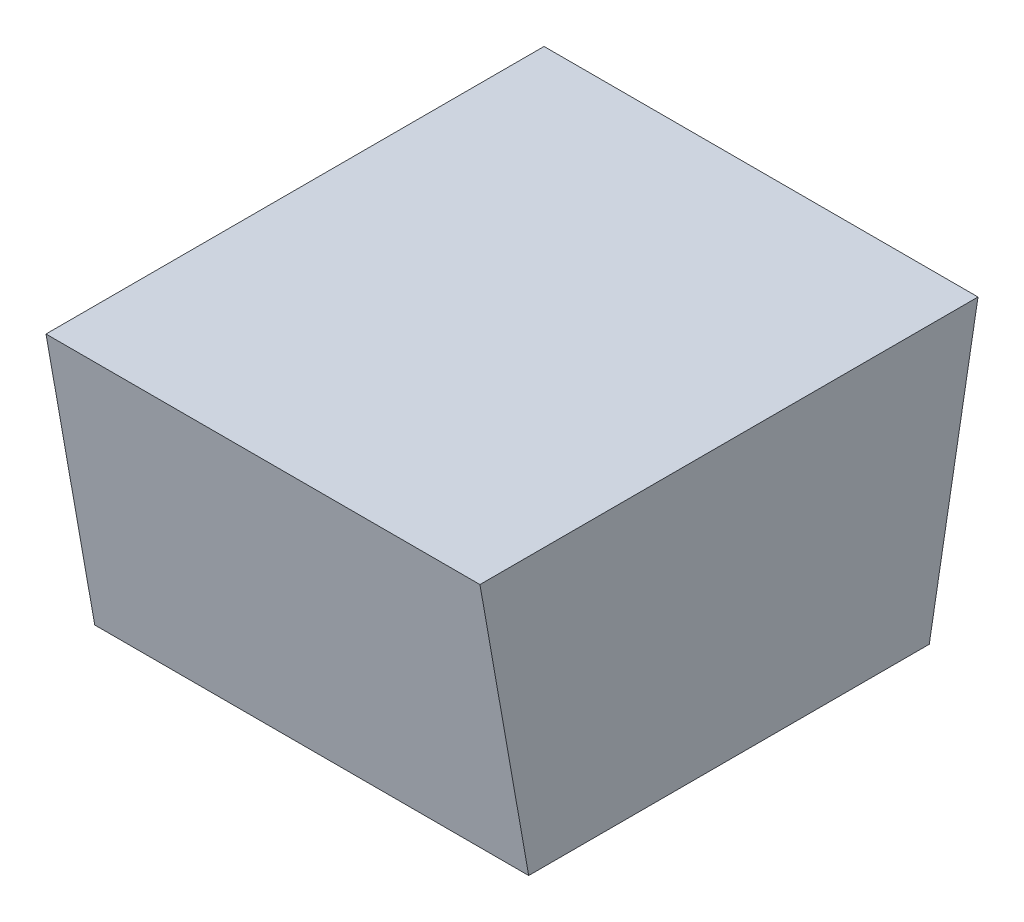
ISO-10303-21;
HEADER;
FILE_DESCRIPTION(('STEP AP214'),'2;1');
FILE_NAME('part.step','',(''),(''),'','','');
FILE_SCHEMA(('AUTOMOTIVE_DESIGN { 1 0 10303 214 1 1 1 1 }'));
ENDSEC;
DATA;
#1=APPLICATION_CONTEXT('core data for automotive mechanical design processes');
#2=APPLICATION_PROTOCOL_DEFINITION('international standard','automotive_design',2000,#1);
#3=PRODUCT_CONTEXT('',#1,'mechanical');
#4=PRODUCT('Part','Part','',(#3));
#5=PRODUCT_RELATED_PRODUCT_CATEGORY('part','',(#4));
#6=PRODUCT_DEFINITION_FORMATION('','',#4);
#7=PRODUCT_DEFINITION_CONTEXT('part definition',#1,'design');
#8=PRODUCT_DEFINITION('design','',#6,#7);
#9=PRODUCT_DEFINITION_SHAPE('','',#8);
#10=(LENGTH_UNIT() NAMED_UNIT(*) SI_UNIT(.MILLI.,.METRE.));
#11=(NAMED_UNIT(*) PLANE_ANGLE_UNIT() SI_UNIT($,.RADIAN.));
#12=(NAMED_UNIT(*) SI_UNIT($,.STERADIAN.) SOLID_ANGLE_UNIT());
#13=UNCERTAINTY_MEASURE_WITH_UNIT(LENGTH_MEASURE(1.E-05),#10,'distance_accuracy_value','');
#14=(GEOMETRIC_REPRESENTATION_CONTEXT(3) GLOBAL_UNCERTAINTY_ASSIGNED_CONTEXT((#13)) GLOBAL_UNIT_ASSIGNED_CONTEXT((#10,
#11,#12)) REPRESENTATION_CONTEXT('',''));
#15=CARTESIAN_POINT('',(0.,0.,0.));
#16=DIRECTION('',(0.,0.,1.));
#17=DIRECTION('',(1.,0.,0.));
#18=AXIS2_PLACEMENT_3D('',#15,#16,#17);
#19=CARTESIAN_POINT('',(0.,0.414017929910338,0.));
#20=DIRECTION('',(0.,1.,0.));
#21=DIRECTION('',(0.,0.,1.));
#22=AXIS2_PLACEMENT_3D('',#19,#20,#21);
#23=PLANE('',#22);
#24=DIRECTION('',(0.,0.,-1.));
#25=VECTOR('',#24,1.);
#26=CARTESIAN_POINT('',(-0.324499859,0.414017929910338,1.508500031));
#27=LINE('',#26,#25);
#28=CARTESIAN_POINT('',(-0.324499859,0.414017929910338,0.373002566540259));
#29=VERTEX_POINT('',#28);
#30=CARTESIAN_POINT('',(-0.324499859,0.414017929910338,-0.373002566540259));
#31=VERTEX_POINT('',#30);
#32=EDGE_CURVE('E92',#29,#31,#27,.T.);
#33=ORIENTED_EDGE('',*,*,#32,.F.);
#34=DIRECTION('',(-1.,0.,0.));
#35=VECTOR('',#34,1.);
#36=CARTESIAN_POINT('',(1.508500031,0.414017929910338,0.373002566540259));
#37=LINE('',#36,#35);
#38=CARTESIAN_POINT('',(0.325500111,0.414017929910338,0.373002566540259));
#39=VERTEX_POINT('',#38);
#40=EDGE_CURVE('E57',#39,#29,#37,.T.);
#41=ORIENTED_EDGE('',*,*,#40,.F.);
#42=DIRECTION('',(0.,0.,1.));
#43=VECTOR('',#42,1.);
#44=CARTESIAN_POINT('',(0.325500111,0.414017929910338,1.508500031));
#45=LINE('',#44,#43);
#46=CARTESIAN_POINT('',(0.325500111,0.414017929910338,-0.373002566540259));
#47=VERTEX_POINT('',#46);
#48=EDGE_CURVE('E12',#47,#39,#45,.T.);
#49=ORIENTED_EDGE('',*,*,#48,.F.);
#50=DIRECTION('',(1.,0.,0.));
#51=VECTOR('',#50,1.);
#52=CARTESIAN_POINT('',(1.508500031,0.414017929910338,-0.373002566540259));
#53=LINE('',#52,#51);
#54=EDGE_CURVE('E81',#31,#47,#53,.T.);
#55=ORIENTED_EDGE('',*,*,#54,.F.);
#56=EDGE_LOOP('',(#33,#41,#49,#55));
#57=FACE_BOUND('',#56,.T.);
#58=ADVANCED_FACE('F42',(#57),#23,.T.);
#59=CARTESIAN_POINT('',(1.508500031,0.,-0.300000035));
#60=DIRECTION('',(0.,-0.173648177666931,-0.984807753012208));
#61=DIRECTION('',(0.,0.984807753012208,-0.173648177666931));
#62=AXIS2_PLACEMENT_3D('',#59,#60,#61);
#63=PLANE('',#62);
#64=DIRECTION('',(0.,0.984807753012208,-0.173648177666931));
#65=VECTOR('',#64,1.);
#66=CARTESIAN_POINT('',(-0.324499859,0.,-0.300000035));
#67=LINE('',#66,#65);
#68=CARTESIAN_POINT('',(-0.324499859,0.,-0.300000035));
#69=VERTEX_POINT('',#68);
#70=EDGE_CURVE('E91',#69,#31,#67,.T.);
#71=ORIENTED_EDGE('',*,*,#70,.T.);
#72=ORIENTED_EDGE('',*,*,#54,.T.);
#73=DIRECTION('',(0.,-0.984807753012208,0.173648177666931));
#74=VECTOR('',#73,1.);
#75=CARTESIAN_POINT('',(0.325500111,0.,-0.300000035));
#76=LINE('',#75,#74);
#77=CARTESIAN_POINT('',(0.325500111,0.,-0.300000035));
#78=VERTEX_POINT('',#77);
#79=EDGE_CURVE('E88',#47,#78,#76,.T.);
#80=ORIENTED_EDGE('',*,*,#79,.T.);
#81=DIRECTION('',(-1.,0.,0.));
#82=VECTOR('',#81,1.);
#83=CARTESIAN_POINT('',(1.508500031,0.,-0.300000035));
#84=LINE('',#83,#82);
#85=EDGE_CURVE('E107',#78,#69,#84,.T.);
#86=ORIENTED_EDGE('',*,*,#85,.T.);
#87=EDGE_LOOP('',(#71,#72,#80,#86));
#88=FACE_BOUND('',#87,.T.);
#89=ADVANCED_FACE('F87',(#88),#63,.T.);
#90=CARTESIAN_POINT('',(1.508500031,0.,0.300000035));
#91=DIRECTION('',(0.,-0.173648177666931,0.984807753012208));
#92=DIRECTION('',(0.,-0.984807753012208,-0.173648177666931));
#93=AXIS2_PLACEMENT_3D('',#90,#91,#92);
#94=PLANE('',#93);
#95=DIRECTION('',(0.,0.984807753012208,0.173648177666931));
#96=VECTOR('',#95,1.);
#97=CARTESIAN_POINT('',(0.325500111,0.,0.300000035));
#98=LINE('',#97,#96);
#99=CARTESIAN_POINT('',(0.325500111,0.,0.300000035));
#100=VERTEX_POINT('',#99);
#101=EDGE_CURVE('E98',#100,#39,#98,.T.);
#102=ORIENTED_EDGE('',*,*,#101,.T.);
#103=ORIENTED_EDGE('',*,*,#40,.T.);
#104=DIRECTION('',(0.,-0.984807753012208,-0.173648177666931));
#105=VECTOR('',#104,1.);
#106=CARTESIAN_POINT('',(-0.324499859,0.,0.300000035));
#107=LINE('',#106,#105);
#108=CARTESIAN_POINT('',(-0.324499859,0.,0.300000035));
#109=VERTEX_POINT('',#108);
#110=EDGE_CURVE('E109',#29,#109,#107,.T.);
#111=ORIENTED_EDGE('',*,*,#110,.T.);
#112=DIRECTION('',(-1.,0.,0.));
#113=VECTOR('',#112,1.);
#114=CARTESIAN_POINT('',(1.508500031,0.,0.300000035));
#115=LINE('',#114,#113);
#116=EDGE_CURVE('E64',#100,#109,#115,.T.);
#117=ORIENTED_EDGE('',*,*,#116,.F.);
#118=EDGE_LOOP('',(#102,#103,#111,#117));
#119=FACE_BOUND('',#118,.T.);
#120=ADVANCED_FACE('F116',(#119),#94,.T.);
#121=CARTESIAN_POINT('',(-0.324499859,0.880000018,1.508500031));
#122=DIRECTION('',(-1.,0.,0.));
#123=DIRECTION('',(0.,-1.,0.));
#124=AXIS2_PLACEMENT_3D('',#121,#122,#123);
#125=PLANE('',#124);
#126=ORIENTED_EDGE('',*,*,#110,.F.);
#127=ORIENTED_EDGE('',*,*,#32,.T.);
#128=ORIENTED_EDGE('',*,*,#70,.F.);
#129=DIRECTION('',(0.,0.,-1.));
#130=VECTOR('',#129,1.);
#131=CARTESIAN_POINT('',(-0.324499859,0.,0.300000035));
#132=LINE('',#131,#130);
#133=EDGE_CURVE('E97',#109,#69,#132,.T.);
#134=ORIENTED_EDGE('',*,*,#133,.F.);
#135=EDGE_LOOP('',(#126,#127,#128,#134));
#136=FACE_BOUND('',#135,.T.);
#137=ADVANCED_FACE('F114',(#136),#125,.T.);
#138=CARTESIAN_POINT('',(0.325500111,-0.00999998,1.508500031));
#139=DIRECTION('',(1.,0.,0.));
#140=DIRECTION('',(0.,1.,0.));
#141=AXIS2_PLACEMENT_3D('',#138,#139,#140);
#142=PLANE('',#141);
#143=ORIENTED_EDGE('',*,*,#79,.F.);
#144=ORIENTED_EDGE('',*,*,#48,.T.);
#145=ORIENTED_EDGE('',*,*,#101,.F.);
#146=DIRECTION('',(0.,0.,1.));
#147=VECTOR('',#146,1.);
#148=CARTESIAN_POINT('',(0.325500111,0.,0.300000035));
#149=LINE('',#148,#147);
#150=EDGE_CURVE('E50',#78,#100,#149,.T.);
#151=ORIENTED_EDGE('',*,*,#150,.F.);
#152=EDGE_LOOP('',(#143,#144,#145,#151));
#153=FACE_BOUND('',#152,.T.);
#154=ADVANCED_FACE('F94',(#153),#142,.T.);
#155=CARTESIAN_POINT('',(0.,0.,0.));
#156=DIRECTION('',(0.,1.,0.));
#157=DIRECTION('',(0.,0.,1.));
#158=AXIS2_PLACEMENT_3D('',#155,#156,#157);
#159=PLANE('',#158);
#160=ORIENTED_EDGE('',*,*,#133,.T.);
#161=ORIENTED_EDGE('',*,*,#85,.F.);
#162=ORIENTED_EDGE('',*,*,#150,.T.);
#163=ORIENTED_EDGE('',*,*,#116,.T.);
#164=EDGE_LOOP('',(#160,#161,#162,#163));
#165=FACE_BOUND('',#164,.T.);
#166=ADVANCED_FACE('F44',(#165),#159,.F.);
#167=CLOSED_SHELL('',(#58,#89,#120,#137,#154,#166));
#168=MANIFOLD_SOLID_BREP('B2',#167);
#169=ADVANCED_BREP_SHAPE_REPRESENTATION('',(#18,#168),#14);
#170=SHAPE_DEFINITION_REPRESENTATION(#9,#169);
ENDSEC;
END-ISO-10303-21;
